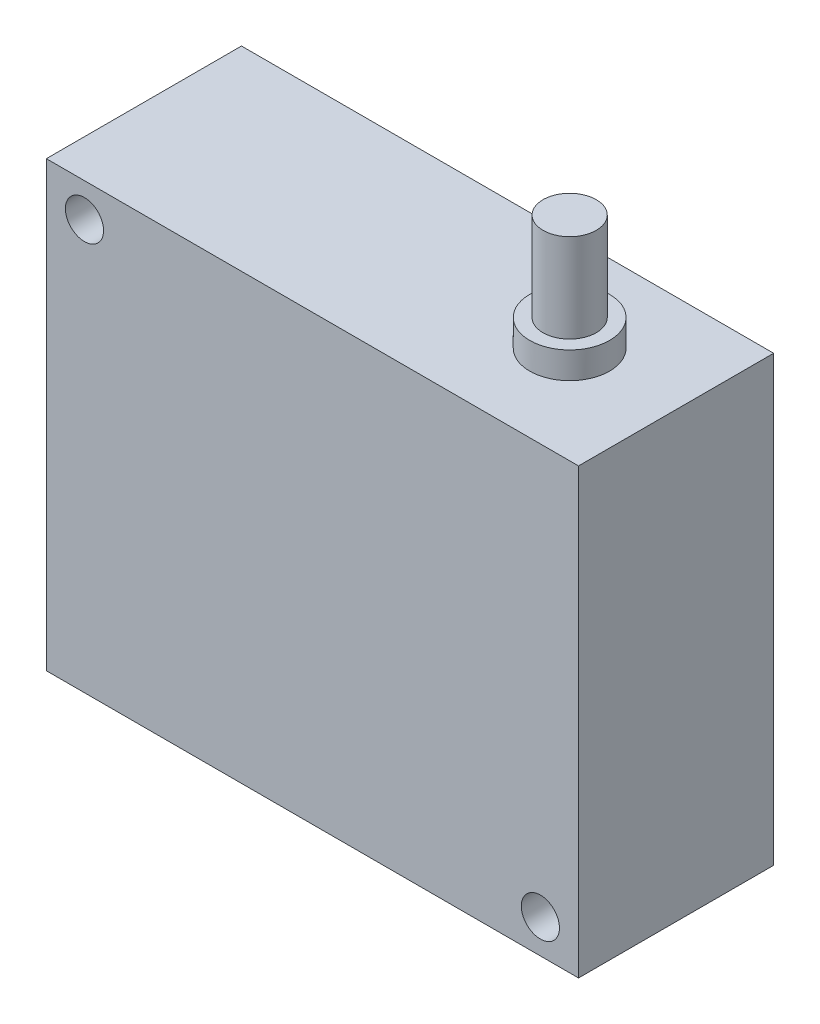
ISO-10303-21;
HEADER;
FILE_DESCRIPTION(('STEP AP214'),'2;1');
FILE_NAME('part.step','',(''),(''),'','','');
FILE_SCHEMA(('AUTOMOTIVE_DESIGN { 1 0 10303 214 1 1 1 1 }'));
ENDSEC;
DATA;
#1=APPLICATION_CONTEXT('core data for automotive mechanical design processes');
#2=APPLICATION_PROTOCOL_DEFINITION('international standard','automotive_design',2000,#1);
#3=PRODUCT_CONTEXT('',#1,'mechanical');
#4=PRODUCT('Part','Part','',(#3));
#5=PRODUCT_RELATED_PRODUCT_CATEGORY('part','',(#4));
#6=PRODUCT_DEFINITION_FORMATION('','',#4);
#7=PRODUCT_DEFINITION_CONTEXT('part definition',#1,'design');
#8=PRODUCT_DEFINITION('design','',#6,#7);
#9=PRODUCT_DEFINITION_SHAPE('','',#8);
#10=(LENGTH_UNIT() NAMED_UNIT(*) SI_UNIT(.MILLI.,.METRE.));
#11=(NAMED_UNIT(*) PLANE_ANGLE_UNIT() SI_UNIT($,.RADIAN.));
#12=(NAMED_UNIT(*) SI_UNIT($,.STERADIAN.) SOLID_ANGLE_UNIT());
#13=UNCERTAINTY_MEASURE_WITH_UNIT(LENGTH_MEASURE(1.E-05),#10,'distance_accuracy_value','');
#14=(GEOMETRIC_REPRESENTATION_CONTEXT(3) GLOBAL_UNCERTAINTY_ASSIGNED_CONTEXT((#13)) GLOBAL_UNIT_ASSIGNED_CONTEXT((#10,
#11,#12)) REPRESENTATION_CONTEXT('',''));
#15=CARTESIAN_POINT('',(0.,0.,0.));
#16=DIRECTION('',(0.,0.,1.));
#17=DIRECTION('',(1.,0.,0.));
#18=AXIS2_PLACEMENT_3D('',#15,#16,#17);
#19=CARTESIAN_POINT('',(0.,0.,22.));
#20=DIRECTION('',(0.,1.,0.));
#21=DIRECTION('',(0.,0.,1.));
#22=AXIS2_PLACEMENT_3D('',#19,#20,#21);
#23=PLANE('',#22);
#24=DIRECTION('',(1.,0.,0.));
#25=VECTOR('',#24,1.);
#26=CARTESIAN_POINT('',(5.,0.,2.5));
#27=LINE('',#26,#25);
#28=CARTESIAN_POINT('',(5.,0.,2.5));
#29=VERTEX_POINT('',#28);
#30=CARTESIAN_POINT('',(45.,0.,2.5));
#31=VERTEX_POINT('',#30);
#32=EDGE_CURVE('E117',#29,#31,#27,.T.);
#33=ORIENTED_EDGE('',*,*,#32,.F.);
#34=DIRECTION('',(0.,0.,-1.));
#35=VECTOR('',#34,1.);
#36=CARTESIAN_POINT('',(5.,0.,12.5));
#37=LINE('',#36,#35);
#38=CARTESIAN_POINT('',(5.,0.,12.5));
#39=VERTEX_POINT('',#38);
#40=EDGE_CURVE('E110',#39,#29,#37,.T.);
#41=ORIENTED_EDGE('',*,*,#40,.F.);
#42=DIRECTION('',(-1.,0.,0.));
#43=VECTOR('',#42,1.);
#44=CARTESIAN_POINT('',(5.,0.,12.5));
#45=LINE('',#44,#43);
#46=CARTESIAN_POINT('',(45.,0.,12.5));
#47=VERTEX_POINT('',#46);
#48=EDGE_CURVE('E132',#47,#39,#45,.T.);
#49=ORIENTED_EDGE('',*,*,#48,.F.);
#50=DIRECTION('',(0.,0.,1.));
#51=VECTOR('',#50,1.);
#52=CARTESIAN_POINT('',(45.,0.,12.5));
#53=LINE('',#52,#51);
#54=EDGE_CURVE('E140',#31,#47,#53,.T.);
#55=ORIENTED_EDGE('',*,*,#54,.F.);
#56=EDGE_LOOP('',(#33,#41,#49,#55));
#57=FACE_BOUND('',#56,.T.);
#58=DIRECTION('',(1.,0.,0.));
#59=VECTOR('',#58,1.);
#60=CARTESIAN_POINT('',(0.,0.,0.));
#61=LINE('',#60,#59);
#62=CARTESIAN_POINT('',(0.,0.,0.));
#63=VERTEX_POINT('',#62);
#64=CARTESIAN_POINT('',(60.,0.,0.));
#65=VERTEX_POINT('',#64);
#66=EDGE_CURVE('E172',#63,#65,#61,.T.);
#67=ORIENTED_EDGE('',*,*,#66,.T.);
#68=DIRECTION('',(0.,0.,-1.));
#69=VECTOR('',#68,1.);
#70=CARTESIAN_POINT('',(60.,0.,22.));
#71=LINE('',#70,#69);
#72=CARTESIAN_POINT('',(60.,0.,22.));
#73=VERTEX_POINT('',#72);
#74=EDGE_CURVE('E161',#73,#65,#71,.T.);
#75=ORIENTED_EDGE('',*,*,#74,.F.);
#76=DIRECTION('',(1.,0.,0.));
#77=VECTOR('',#76,1.);
#78=CARTESIAN_POINT('',(0.,0.,22.));
#79=LINE('',#78,#77);
#80=CARTESIAN_POINT('',(0.,0.,22.));
#81=VERTEX_POINT('',#80);
#82=EDGE_CURVE('E160',#81,#73,#79,.T.);
#83=ORIENTED_EDGE('',*,*,#82,.F.);
#84=DIRECTION('',(0.,0.,-1.));
#85=VECTOR('',#84,1.);
#86=CARTESIAN_POINT('',(0.,0.,22.));
#87=LINE('',#86,#85);
#88=EDGE_CURVE('E156',#81,#63,#87,.T.);
#89=ORIENTED_EDGE('',*,*,#88,.T.);
#90=EDGE_LOOP('',(#67,#75,#83,#89));
#91=FACE_BOUND('',#90,.T.);
#92=ADVANCED_FACE('F47',(#57,#91),#23,.F.);
#93=CARTESIAN_POINT('',(48.,53.,11.));
#94=DIRECTION('',(0.,1.,0.));
#95=DIRECTION('',(0.,0.,1.));
#96=AXIS2_PLACEMENT_3D('',#93,#94,#95);
#97=PLANE('',#96);
#98=CARTESIAN_POINT('',(48.,53.,11.));
#99=DIRECTION('',(0.,1.,0.));
#100=DIRECTION('',(0.,0.,1.));
#101=AXIS2_PLACEMENT_3D('',#98,#99,#100);
#102=CIRCLE('',#101,4.5);
#103=CARTESIAN_POINT('',(48.,53.,15.5));
#104=VERTEX_POINT('',#103);
#105=EDGE_CURVE('E152',#104,#104,#102,.T.);
#106=ORIENTED_EDGE('',*,*,#105,.T.);
#107=EDGE_LOOP('',(#106));
#108=FACE_BOUND('',#107,.T.);
#109=CARTESIAN_POINT('',(48.,53.,11.));
#110=DIRECTION('',(0.,1.,0.));
#111=DIRECTION('',(0.,0.,1.));
#112=AXIS2_PLACEMENT_3D('',#109,#110,#111);
#113=CIRCLE('',#112,3.);
#114=CARTESIAN_POINT('',(48.,53.,14.));
#115=VERTEX_POINT('',#114);
#116=EDGE_CURVE('E148',#115,#115,#113,.T.);
#117=ORIENTED_EDGE('',*,*,#116,.F.);
#118=EDGE_LOOP('',(#117));
#119=FACE_BOUND('',#118,.T.);
#120=ADVANCED_FACE('F246',(#108,#119),#97,.T.);
#121=CARTESIAN_POINT('',(0.,50.,22.));
#122=DIRECTION('',(0.,-1.,0.));
#123=DIRECTION('',(0.,0.,-1.));
#124=AXIS2_PLACEMENT_3D('',#121,#122,#123);
#125=PLANE('',#124);
#126=DIRECTION('',(-1.,0.,0.));
#127=VECTOR('',#126,1.);
#128=CARTESIAN_POINT('',(0.,50.,0.));
#129=LINE('',#128,#127);
#130=CARTESIAN_POINT('',(60.,50.,0.));
#131=VERTEX_POINT('',#130);
#132=CARTESIAN_POINT('',(0.,50.,0.));
#133=VERTEX_POINT('',#132);
#134=EDGE_CURVE('E155',#131,#133,#129,.T.);
#135=ORIENTED_EDGE('',*,*,#134,.T.);
#136=DIRECTION('',(0.,0.,-1.));
#137=VECTOR('',#136,1.);
#138=CARTESIAN_POINT('',(0.,50.,22.));
#139=LINE('',#138,#137);
#140=CARTESIAN_POINT('',(0.,50.,22.));
#141=VERTEX_POINT('',#140);
#142=EDGE_CURVE('E170',#141,#133,#139,.T.);
#143=ORIENTED_EDGE('',*,*,#142,.F.);
#144=DIRECTION('',(-1.,0.,0.));
#145=VECTOR('',#144,1.);
#146=CARTESIAN_POINT('',(0.,50.,22.));
#147=LINE('',#146,#145);
#148=CARTESIAN_POINT('',(60.,50.,22.));
#149=VERTEX_POINT('',#148);
#150=EDGE_CURVE('E165',#149,#141,#147,.T.);
#151=ORIENTED_EDGE('',*,*,#150,.F.);
#152=DIRECTION('',(0.,0.,-1.));
#153=VECTOR('',#152,1.);
#154=CARTESIAN_POINT('',(60.,50.,22.));
#155=LINE('',#154,#153);
#156=EDGE_CURVE('E171',#149,#131,#155,.T.);
#157=ORIENTED_EDGE('',*,*,#156,.T.);
#158=EDGE_LOOP('',(#135,#143,#151,#157));
#159=FACE_BOUND('',#158,.T.);
#160=CARTESIAN_POINT('',(48.,50.,11.));
#161=DIRECTION('',(0.,-1.,0.));
#162=DIRECTION('',(0.,0.,-1.));
#163=AXIS2_PLACEMENT_3D('',#160,#161,#162);
#164=CIRCLE('',#163,4.5);
#165=CARTESIAN_POINT('',(48.,50.,6.5));
#166=VERTEX_POINT('',#165);
#167=EDGE_CURVE('E151',#166,#166,#164,.F.);
#168=ORIENTED_EDGE('',*,*,#167,.F.);
#169=EDGE_LOOP('',(#168));
#170=FACE_BOUND('',#169,.T.);
#171=ADVANCED_FACE('F232',(#159,#170),#125,.F.);
#172=CARTESIAN_POINT('',(0.,0.,22.));
#173=DIRECTION('',(1.,0.,0.));
#174=DIRECTION('',(0.,0.,-1.));
#175=AXIS2_PLACEMENT_3D('',#172,#173,#174);
#176=PLANE('',#175);
#177=DIRECTION('',(0.,-1.,0.));
#178=VECTOR('',#177,1.);
#179=CARTESIAN_POINT('',(0.,0.,0.));
#180=LINE('',#179,#178);
#181=EDGE_CURVE('E167',#133,#63,#180,.T.);
#182=ORIENTED_EDGE('',*,*,#181,.T.);
#183=ORIENTED_EDGE('',*,*,#88,.F.);
#184=DIRECTION('',(0.,-1.,0.));
#185=VECTOR('',#184,1.);
#186=CARTESIAN_POINT('',(0.,0.,22.));
#187=LINE('',#186,#185);
#188=EDGE_CURVE('E157',#141,#81,#187,.T.);
#189=ORIENTED_EDGE('',*,*,#188,.F.);
#190=ORIENTED_EDGE('',*,*,#142,.T.);
#191=EDGE_LOOP('',(#182,#183,#189,#190));
#192=FACE_BOUND('',#191,.T.);
#193=ADVANCED_FACE('F223',(#192),#176,.F.);
#194=CARTESIAN_POINT('',(60.,0.,22.));
#195=DIRECTION('',(-1.,0.,0.));
#196=DIRECTION('',(0.,0.,1.));
#197=AXIS2_PLACEMENT_3D('',#194,#195,#196);
#198=PLANE('',#197);
#199=DIRECTION('',(0.,1.,0.));
#200=VECTOR('',#199,1.);
#201=CARTESIAN_POINT('',(60.,0.,0.));
#202=LINE('',#201,#200);
#203=EDGE_CURVE('E175',#65,#131,#202,.T.);
#204=ORIENTED_EDGE('',*,*,#203,.T.);
#205=ORIENTED_EDGE('',*,*,#156,.F.);
#206=DIRECTION('',(0.,1.,0.));
#207=VECTOR('',#206,1.);
#208=CARTESIAN_POINT('',(60.,0.,22.));
#209=LINE('',#208,#207);
#210=EDGE_CURVE('E163',#73,#149,#209,.T.);
#211=ORIENTED_EDGE('',*,*,#210,.F.);
#212=ORIENTED_EDGE('',*,*,#74,.T.);
#213=EDGE_LOOP('',(#204,#205,#211,#212));
#214=FACE_BOUND('',#213,.T.);
#215=ADVANCED_FACE('F213',(#214),#198,.F.);
#216=CARTESIAN_POINT('',(0.,0.,22.));
#217=DIRECTION('',(0.,0.,-1.));
#218=DIRECTION('',(-1.,0.,0.));
#219=AXIS2_PLACEMENT_3D('',#216,#217,#218);
#220=PLANE('',#219);
#221=CARTESIAN_POINT('',(4.30000000000001,46.2,22.));
#222=DIRECTION('',(0.,0.,1.));
#223=DIRECTION('',(1.,0.,0.));
#224=AXIS2_PLACEMENT_3D('',#221,#222,#223);
#225=CIRCLE('',#224,2.15);
#226=CARTESIAN_POINT('',(6.45000000000001,46.2,22.));
#227=VERTEX_POINT('',#226);
#228=EDGE_CURVE('E194',#227,#227,#225,.T.);
#229=ORIENTED_EDGE('',*,*,#228,.F.);
#230=EDGE_LOOP('',(#229));
#231=FACE_BOUND('',#230,.T.);
#232=CARTESIAN_POINT('',(55.7,3.8,22.));
#233=DIRECTION('',(0.,0.,1.));
#234=DIRECTION('',(1.,0.,0.));
#235=AXIS2_PLACEMENT_3D('',#232,#233,#234);
#236=CIRCLE('',#235,2.15);
#237=CARTESIAN_POINT('',(57.85,3.8,22.));
#238=VERTEX_POINT('',#237);
#239=EDGE_CURVE('E188',#238,#238,#236,.T.);
#240=ORIENTED_EDGE('',*,*,#239,.F.);
#241=EDGE_LOOP('',(#240));
#242=FACE_BOUND('',#241,.T.);
#243=ORIENTED_EDGE('',*,*,#188,.T.);
#244=ORIENTED_EDGE('',*,*,#82,.T.);
#245=ORIENTED_EDGE('',*,*,#210,.T.);
#246=ORIENTED_EDGE('',*,*,#150,.T.);
#247=EDGE_LOOP('',(#243,#244,#245,#246));
#248=FACE_BOUND('',#247,.T.);
#249=ADVANCED_FACE('F210',(#231,#242,#248),#220,.F.);
#250=CARTESIAN_POINT('',(0.,0.,0.));
#251=DIRECTION('',(0.,0.,-1.));
#252=DIRECTION('',(-1.,0.,0.));
#253=AXIS2_PLACEMENT_3D('',#250,#251,#252);
#254=PLANE('',#253);
#255=CARTESIAN_POINT('',(4.30000000000001,46.2,0.));
#256=DIRECTION('',(0.,0.,1.));
#257=DIRECTION('',(1.,0.,0.));
#258=AXIS2_PLACEMENT_3D('',#255,#256,#257);
#259=CIRCLE('',#258,2.15);
#260=CARTESIAN_POINT('',(6.45000000000001,46.2,0.));
#261=VERTEX_POINT('',#260);
#262=EDGE_CURVE('E191',#261,#261,#259,.T.);
#263=ORIENTED_EDGE('',*,*,#262,.T.);
#264=EDGE_LOOP('',(#263));
#265=FACE_BOUND('',#264,.T.);
#266=CARTESIAN_POINT('',(55.7,3.8,0.));
#267=DIRECTION('',(0.,0.,1.));
#268=DIRECTION('',(1.,0.,0.));
#269=AXIS2_PLACEMENT_3D('',#266,#267,#268);
#270=CIRCLE('',#269,2.15);
#271=CARTESIAN_POINT('',(57.85,3.8,0.));
#272=VERTEX_POINT('',#271);
#273=EDGE_CURVE('E174',#272,#272,#270,.T.);
#274=ORIENTED_EDGE('',*,*,#273,.T.);
#275=EDGE_LOOP('',(#274));
#276=FACE_BOUND('',#275,.T.);
#277=ORIENTED_EDGE('',*,*,#181,.F.);
#278=ORIENTED_EDGE('',*,*,#134,.F.);
#279=ORIENTED_EDGE('',*,*,#203,.F.);
#280=ORIENTED_EDGE('',*,*,#66,.F.);
#281=EDGE_LOOP('',(#277,#278,#279,#280));
#282=FACE_BOUND('',#281,.T.);
#283=ADVANCED_FACE('F200',(#265,#276,#282),#254,.T.);
#284=CARTESIAN_POINT('',(48.,53.,11.));
#285=DIRECTION('',(0.,-1.,0.));
#286=DIRECTION('',(0.,0.,-1.));
#287=AXIS2_PLACEMENT_3D('',#284,#285,#286);
#288=CYLINDRICAL_SURFACE('',#287,4.5);
#289=ORIENTED_EDGE('',*,*,#105,.F.);
#290=EDGE_LOOP('',(#289));
#291=FACE_BOUND('',#290,.T.);
#292=ORIENTED_EDGE('',*,*,#167,.T.);
#293=EDGE_LOOP('',(#292));
#294=FACE_BOUND('',#293,.T.);
#295=ADVANCED_FACE('F236',(#291,#294),#288,.T.);
#296=CARTESIAN_POINT('',(48.,63.,11.));
#297=DIRECTION('',(0.,-1.,0.));
#298=DIRECTION('',(0.,0.,-1.));
#299=AXIS2_PLACEMENT_3D('',#296,#297,#298);
#300=CYLINDRICAL_SURFACE('',#299,3.);
#301=CARTESIAN_POINT('',(48.,63.,11.));
#302=DIRECTION('',(0.,1.,0.));
#303=DIRECTION('',(0.,0.,1.));
#304=AXIS2_PLACEMENT_3D('',#301,#302,#303);
#305=CIRCLE('',#304,3.);
#306=CARTESIAN_POINT('',(48.,63.,14.));
#307=VERTEX_POINT('',#306);
#308=EDGE_CURVE('E135',#307,#307,#305,.T.);
#309=ORIENTED_EDGE('',*,*,#308,.F.);
#310=EDGE_LOOP('',(#309));
#311=FACE_BOUND('',#310,.T.);
#312=ORIENTED_EDGE('',*,*,#116,.T.);
#313=EDGE_LOOP('',(#312));
#314=FACE_BOUND('',#313,.T.);
#315=ADVANCED_FACE('F241',(#311,#314),#300,.T.);
#316=CARTESIAN_POINT('',(48.,63.,11.));
#317=DIRECTION('',(0.,1.,0.));
#318=DIRECTION('',(0.,0.,1.));
#319=AXIS2_PLACEMENT_3D('',#316,#317,#318);
#320=PLANE('',#319);
#321=ORIENTED_EDGE('',*,*,#308,.T.);
#322=EDGE_LOOP('',(#321));
#323=FACE_BOUND('',#322,.T.);
#324=ADVANCED_FACE('F323',(#323),#320,.T.);
#325=CARTESIAN_POINT('',(5.,0.01,12.5));
#326=DIRECTION('',(-1.,0.,0.));
#327=DIRECTION('',(0.,0.,1.));
#328=AXIS2_PLACEMENT_3D('',#325,#326,#327);
#329=PLANE('',#328);
#330=ORIENTED_EDGE('',*,*,#40,.T.);
#331=DIRECTION('',(0.,-1.,0.));
#332=VECTOR('',#331,1.);
#333=CARTESIAN_POINT('',(5.,0.01,2.5));
#334=LINE('',#333,#332);
#335=CARTESIAN_POINT('',(5.,0.01,2.5));
#336=VERTEX_POINT('',#335);
#337=EDGE_CURVE('E113',#336,#29,#334,.T.);
#338=ORIENTED_EDGE('',*,*,#337,.F.);
#339=DIRECTION('',(0.,0.,-1.));
#340=VECTOR('',#339,1.);
#341=CARTESIAN_POINT('',(5.,0.01,12.5));
#342=LINE('',#341,#340);
#343=CARTESIAN_POINT('',(5.,0.01,12.5));
#344=VERTEX_POINT('',#343);
#345=EDGE_CURVE('E51',#344,#336,#342,.T.);
#346=ORIENTED_EDGE('',*,*,#345,.F.);
#347=DIRECTION('',(0.,-1.,0.));
#348=VECTOR('',#347,1.);
#349=CARTESIAN_POINT('',(5.,0.01,12.5));
#350=LINE('',#349,#348);
#351=EDGE_CURVE('E130',#344,#39,#350,.T.);
#352=ORIENTED_EDGE('',*,*,#351,.T.);
#353=EDGE_LOOP('',(#330,#338,#346,#352));
#354=FACE_BOUND('',#353,.T.);
#355=ADVANCED_FACE('F114',(#354),#329,.F.);
#356=CARTESIAN_POINT('',(5.,0.01,12.5));
#357=DIRECTION('',(0.,0.,1.));
#358=DIRECTION('',(1.,0.,0.));
#359=AXIS2_PLACEMENT_3D('',#356,#357,#358);
#360=PLANE('',#359);
#361=ORIENTED_EDGE('',*,*,#48,.T.);
#362=ORIENTED_EDGE('',*,*,#351,.F.);
#363=DIRECTION('',(-1.,0.,0.));
#364=VECTOR('',#363,1.);
#365=CARTESIAN_POINT('',(5.,0.01,12.5));
#366=LINE('',#365,#364);
#367=CARTESIAN_POINT('',(45.,0.01,12.5));
#368=VERTEX_POINT('',#367);
#369=EDGE_CURVE('E12',#368,#344,#366,.T.);
#370=ORIENTED_EDGE('',*,*,#369,.F.);
#371=DIRECTION('',(0.,-1.,0.));
#372=VECTOR('',#371,1.);
#373=CARTESIAN_POINT('',(45.,0.01,12.5));
#374=LINE('',#373,#372);
#375=EDGE_CURVE('E128',#368,#47,#374,.T.);
#376=ORIENTED_EDGE('',*,*,#375,.T.);
#377=EDGE_LOOP('',(#361,#362,#370,#376));
#378=FACE_BOUND('',#377,.T.);
#379=ADVANCED_FACE('F127',(#378),#360,.F.);
#380=CARTESIAN_POINT('',(45.,0.01,12.5));
#381=DIRECTION('',(1.,0.,0.));
#382=DIRECTION('',(0.,0.,-1.));
#383=AXIS2_PLACEMENT_3D('',#380,#381,#382);
#384=PLANE('',#383);
#385=ORIENTED_EDGE('',*,*,#54,.T.);
#386=ORIENTED_EDGE('',*,*,#375,.F.);
#387=DIRECTION('',(0.,0.,1.));
#388=VECTOR('',#387,1.);
#389=CARTESIAN_POINT('',(45.,0.01,12.5));
#390=LINE('',#389,#388);
#391=CARTESIAN_POINT('',(45.,0.01,2.5));
#392=VERTEX_POINT('',#391);
#393=EDGE_CURVE('E57',#392,#368,#390,.T.);
#394=ORIENTED_EDGE('',*,*,#393,.F.);
#395=DIRECTION('',(0.,-1.,0.));
#396=VECTOR('',#395,1.);
#397=CARTESIAN_POINT('',(45.,0.01,2.5));
#398=LINE('',#397,#396);
#399=EDGE_CURVE('E65',#392,#31,#398,.T.);
#400=ORIENTED_EDGE('',*,*,#399,.T.);
#401=EDGE_LOOP('',(#385,#386,#394,#400));
#402=FACE_BOUND('',#401,.T.);
#403=ADVANCED_FACE('F305',(#402),#384,.F.);
#404=CARTESIAN_POINT('',(5.,0.01,2.5));
#405=DIRECTION('',(0.,0.,-1.));
#406=DIRECTION('',(-1.,0.,0.));
#407=AXIS2_PLACEMENT_3D('',#404,#405,#406);
#408=PLANE('',#407);
#409=ORIENTED_EDGE('',*,*,#32,.T.);
#410=ORIENTED_EDGE('',*,*,#399,.F.);
#411=DIRECTION('',(1.,0.,0.));
#412=VECTOR('',#411,1.);
#413=CARTESIAN_POINT('',(5.,0.01,2.5));
#414=LINE('',#413,#412);
#415=EDGE_CURVE('E120',#336,#392,#414,.T.);
#416=ORIENTED_EDGE('',*,*,#415,.F.);
#417=ORIENTED_EDGE('',*,*,#337,.T.);
#418=EDGE_LOOP('',(#409,#410,#416,#417));
#419=FACE_BOUND('',#418,.T.);
#420=ADVANCED_FACE('F121',(#419),#408,.F.);
#421=CARTESIAN_POINT('',(0.,0.01,0.));
#422=DIRECTION('',(0.,-1.,0.));
#423=DIRECTION('',(0.,0.,-1.));
#424=AXIS2_PLACEMENT_3D('',#421,#422,#423);
#425=PLANE('',#424);
#426=ORIENTED_EDGE('',*,*,#345,.T.);
#427=ORIENTED_EDGE('',*,*,#415,.T.);
#428=ORIENTED_EDGE('',*,*,#393,.T.);
#429=ORIENTED_EDGE('',*,*,#369,.T.);
#430=EDGE_LOOP('',(#426,#427,#428,#429));
#431=FACE_BOUND('',#430,.T.);
#432=ADVANCED_FACE('F49',(#431),#425,.T.);
#433=CARTESIAN_POINT('',(55.7,3.8,0.));
#434=DIRECTION('',(0.,0.,1.));
#435=DIRECTION('',(1.,0.,0.));
#436=AXIS2_PLACEMENT_3D('',#433,#434,#435);
#437=CYLINDRICAL_SURFACE('',#436,2.15);
#438=ORIENTED_EDGE('',*,*,#273,.F.);
#439=EDGE_LOOP('',(#438));
#440=FACE_BOUND('',#439,.T.);
#441=ORIENTED_EDGE('',*,*,#239,.T.);
#442=EDGE_LOOP('',(#441));
#443=FACE_BOUND('',#442,.T.);
#444=ADVANCED_FACE('F206',(#440,#443),#437,.F.);
#445=CARTESIAN_POINT('',(4.30000000000001,46.2,0.));
#446=DIRECTION('',(0.,0.,1.));
#447=DIRECTION('',(1.,0.,0.));
#448=AXIS2_PLACEMENT_3D('',#445,#446,#447);
#449=CYLINDRICAL_SURFACE('',#448,2.15);
#450=ORIENTED_EDGE('',*,*,#262,.F.);
#451=EDGE_LOOP('',(#450));
#452=FACE_BOUND('',#451,.T.);
#453=ORIENTED_EDGE('',*,*,#228,.T.);
#454=EDGE_LOOP('',(#453));
#455=FACE_BOUND('',#454,.T.);
#456=ADVANCED_FACE('F203',(#452,#455),#449,.F.);
#457=CLOSED_SHELL('',(#92,#120,#171,#193,#215,#249,#283,#295,#315,#324,#355,#379,#403,#420,#432,
#444,#456));
#458=MANIFOLD_SOLID_BREP('B2',#457);
#459=CARTESIAN_POINT('',(12.5,-5.,7.5));
#460=DIRECTION('',(0.,-1.,0.));
#461=DIRECTION('',(0.,0.,-1.));
#462=AXIS2_PLACEMENT_3D('',#459,#460,#461);
#463=PLANE('',#462);
#464=DIRECTION('',(1.,0.,0.));
#465=VECTOR('',#464,1.);
#466=CARTESIAN_POINT('',(0.,-5.,7.5));
#467=LINE('',#466,#465);
#468=CARTESIAN_POINT('',(12.,-5.,7.5));
#469=VERTEX_POINT('',#468);
#470=CARTESIAN_POINT('',(13.,-5.,7.5));
#471=VERTEX_POINT('',#470);
#472=EDGE_CURVE('E405',#469,#471,#467,.T.);
#473=ORIENTED_EDGE('',*,*,#472,.F.);
#474=CARTESIAN_POINT('',(12.5,-5.,7.5));
#475=DIRECTION('',(0.,-1.,0.));
#476=DIRECTION('',(0.,0.,-1.));
#477=AXIS2_PLACEMENT_3D('',#474,#475,#476);
#478=CIRCLE('',#477,0.500000000000001);
#479=EDGE_CURVE('E396',#469,#471,#478,.T.);
#480=ORIENTED_EDGE('',*,*,#479,.T.);
#481=EDGE_LOOP('',(#473,#480));
#482=FACE_BOUND('',#481,.T.);
#483=ADVANCED_FACE('F388',(#482),#463,.T.);
#484=CARTESIAN_POINT('',(12.5,-5.,7.5));
#485=DIRECTION('',(0.,1.,0.));
#486=DIRECTION('',(0.,0.,1.));
#487=AXIS2_PLACEMENT_3D('',#484,#485,#486);
#488=CYLINDRICAL_SURFACE('',#487,0.500000000000001);
#489=CARTESIAN_POINT('',(12.5,-5.,7.5));
#490=DIRECTION('',(0.,0.707106781186551,-0.707106781186544));
#491=DIRECTION('',(0.,0.707106781186544,0.707106781186551));
#492=AXIS2_PLACEMENT_3D('',#489,#490,#491);
#493=ELLIPSE('',#492,0.707106781186546,0.500000000000001);
#494=EDGE_CURVE('E45',#469,#471,#493,.T.);
#495=ORIENTED_EDGE('',*,*,#494,.T.);
#496=ORIENTED_EDGE('',*,*,#479,.F.);
#497=EDGE_LOOP('',(#495,#496));
#498=FACE_BOUND('',#497,.T.);
#499=CARTESIAN_POINT('',(12.5,0.,7.5));
#500=DIRECTION('',(0.,-1.,0.));
#501=DIRECTION('',(0.,0.,-1.));
#502=AXIS2_PLACEMENT_3D('',#499,#500,#501);
#503=CIRCLE('',#502,0.500000000000001);
#504=CARTESIAN_POINT('',(12.5,0.,7.));
#505=VERTEX_POINT('',#504);
#506=EDGE_CURVE('E408',#505,#505,#503,.T.);
#507=ORIENTED_EDGE('',*,*,#506,.T.);
#508=EDGE_LOOP('',(#507));
#509=FACE_BOUND('',#508,.T.);
#510=ADVANCED_FACE('F390',(#498,#509),#488,.T.);
#511=CARTESIAN_POINT('',(0.,0.,0.));
#512=DIRECTION('',(0.,-1.,0.));
#513=DIRECTION('',(0.,0.,-1.));
#514=AXIS2_PLACEMENT_3D('',#511,#512,#513);
#515=PLANE('',#514);
#516=ORIENTED_EDGE('',*,*,#506,.F.);
#517=EDGE_LOOP('',(#516));
#518=FACE_BOUND('',#517,.T.);
#519=ADVANCED_FACE('F415',(#518),#515,.F.);
#520=CARTESIAN_POINT('',(0.,-5.,7.5));
#521=DIRECTION('',(0.,0.707106781186551,-0.707106781186544));
#522=DIRECTION('',(0.,0.707106781186544,0.707106781186551));
#523=AXIS2_PLACEMENT_3D('',#520,#521,#522);
#524=PLANE('',#523);
#525=ORIENTED_EDGE('',*,*,#494,.F.);
#526=ORIENTED_EDGE('',*,*,#472,.T.);
#527=EDGE_LOOP('',(#525,#526));
#528=FACE_BOUND('',#527,.T.);
#529=ADVANCED_FACE('F404',(#528),#524,.F.);
#530=CLOSED_SHELL('',(#483,#510,#519,#529));
#531=MANIFOLD_SOLID_BREP('B6',#530);
#532=ADVANCED_BREP_SHAPE_REPRESENTATION('',(#18,#458,#531),#14);
#533=SHAPE_DEFINITION_REPRESENTATION(#9,#532);
ENDSEC;
END-ISO-10303-21;
